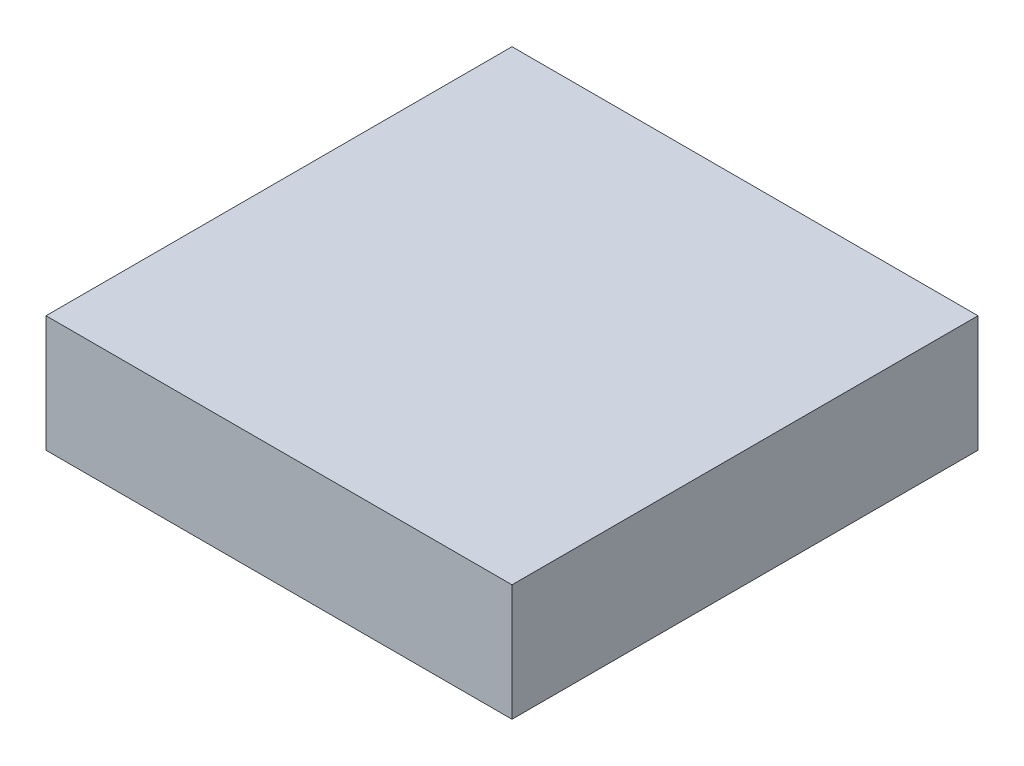
ISO-10303-21;
HEADER;
FILE_DESCRIPTION(('STEP AP214'),'2;1');
FILE_NAME('part.step','',(''),(''),'','','');
FILE_SCHEMA(('AUTOMOTIVE_DESIGN { 1 0 10303 214 1 1 1 1 }'));
ENDSEC;
DATA;
#1=APPLICATION_CONTEXT('core data for automotive mechanical design processes');
#2=APPLICATION_PROTOCOL_DEFINITION('international standard','automotive_design',2000,#1);
#3=PRODUCT_CONTEXT('',#1,'mechanical');
#4=PRODUCT('Part','Part','',(#3));
#5=PRODUCT_RELATED_PRODUCT_CATEGORY('part','',(#4));
#6=PRODUCT_DEFINITION_FORMATION('','',#4);
#7=PRODUCT_DEFINITION_CONTEXT('part definition',#1,'design');
#8=PRODUCT_DEFINITION('design','',#6,#7);
#9=PRODUCT_DEFINITION_SHAPE('','',#8);
#10=(LENGTH_UNIT() NAMED_UNIT(*) SI_UNIT(.MILLI.,.METRE.));
#11=(NAMED_UNIT(*) PLANE_ANGLE_UNIT() SI_UNIT($,.RADIAN.));
#12=(NAMED_UNIT(*) SI_UNIT($,.STERADIAN.) SOLID_ANGLE_UNIT());
#13=UNCERTAINTY_MEASURE_WITH_UNIT(LENGTH_MEASURE(1.E-05),#10,'distance_accuracy_value','');
#14=(GEOMETRIC_REPRESENTATION_CONTEXT(3) GLOBAL_UNCERTAINTY_ASSIGNED_CONTEXT((#13)) GLOBAL_UNIT_ASSIGNED_CONTEXT((#10,
#11,#12)) REPRESENTATION_CONTEXT('',''));
#15=CARTESIAN_POINT('',(0.,0.,0.));
#16=DIRECTION('',(0.,0.,1.));
#17=DIRECTION('',(1.,0.,0.));
#18=AXIS2_PLACEMENT_3D('',#15,#16,#17);
#19=CARTESIAN_POINT('',(-100.,50.,100.));
#20=DIRECTION('',(1.,0.,0.));
#21=DIRECTION('',(0.,0.,-1.));
#22=AXIS2_PLACEMENT_3D('',#19,#20,#21);
#23=PLANE('',#22);
#24=DIRECTION('',(0.,0.,1.));
#25=VECTOR('',#24,1.);
#26=CARTESIAN_POINT('',(-100.,0.,100.));
#27=LINE('',#26,#25);
#28=CARTESIAN_POINT('',(-100.,0.,-100.));
#29=VERTEX_POINT('',#28);
#30=CARTESIAN_POINT('',(-100.,0.,100.));
#31=VERTEX_POINT('',#30);
#32=EDGE_CURVE('E96',#29,#31,#27,.T.);
#33=ORIENTED_EDGE('',*,*,#32,.T.);
#34=DIRECTION('',(0.,-1.,0.));
#35=VECTOR('',#34,1.);
#36=CARTESIAN_POINT('',(-100.,50.,100.));
#37=LINE('',#36,#35);
#38=CARTESIAN_POINT('',(-100.,50.,100.));
#39=VERTEX_POINT('',#38);
#40=EDGE_CURVE('E11',#39,#31,#37,.T.);
#41=ORIENTED_EDGE('',*,*,#40,.F.);
#42=DIRECTION('',(0.,0.,1.));
#43=VECTOR('',#42,1.);
#44=CARTESIAN_POINT('',(-100.,50.,100.));
#45=LINE('',#44,#43);
#46=CARTESIAN_POINT('',(-100.,50.,-100.));
#47=VERTEX_POINT('',#46);
#48=EDGE_CURVE('E84',#47,#39,#45,.T.);
#49=ORIENTED_EDGE('',*,*,#48,.F.);
#50=DIRECTION('',(0.,-1.,0.));
#51=VECTOR('',#50,1.);
#52=CARTESIAN_POINT('',(-100.,50.,-100.));
#53=LINE('',#52,#51);
#54=EDGE_CURVE('E92',#47,#29,#53,.T.);
#55=ORIENTED_EDGE('',*,*,#54,.T.);
#56=EDGE_LOOP('',(#33,#41,#49,#55));
#57=FACE_BOUND('',#56,.T.);
#58=ADVANCED_FACE('F33',(#57),#23,.F.);
#59=CARTESIAN_POINT('',(100.,50.,100.));
#60=DIRECTION('',(0.,0.,-1.));
#61=DIRECTION('',(-1.,0.,0.));
#62=AXIS2_PLACEMENT_3D('',#59,#60,#61);
#63=PLANE('',#62);
#64=DIRECTION('',(1.,0.,0.));
#65=VECTOR('',#64,1.);
#66=CARTESIAN_POINT('',(100.,0.,100.));
#67=LINE('',#66,#65);
#68=CARTESIAN_POINT('',(100.,0.,100.));
#69=VERTEX_POINT('',#68);
#70=EDGE_CURVE('E88',#31,#69,#67,.T.);
#71=ORIENTED_EDGE('',*,*,#70,.T.);
#72=DIRECTION('',(0.,-1.,0.));
#73=VECTOR('',#72,1.);
#74=CARTESIAN_POINT('',(100.,50.,100.));
#75=LINE('',#74,#73);
#76=CARTESIAN_POINT('',(100.,50.,100.));
#77=VERTEX_POINT('',#76);
#78=EDGE_CURVE('E41',#77,#69,#75,.T.);
#79=ORIENTED_EDGE('',*,*,#78,.F.);
#80=DIRECTION('',(1.,0.,0.));
#81=VECTOR('',#80,1.);
#82=CARTESIAN_POINT('',(100.,50.,100.));
#83=LINE('',#82,#81);
#84=EDGE_CURVE('E79',#39,#77,#83,.T.);
#85=ORIENTED_EDGE('',*,*,#84,.F.);
#86=ORIENTED_EDGE('',*,*,#40,.T.);
#87=EDGE_LOOP('',(#71,#79,#85,#86));
#88=FACE_BOUND('',#87,.T.);
#89=ADVANCED_FACE('F87',(#88),#63,.F.);
#90=CARTESIAN_POINT('',(100.,50.,100.));
#91=DIRECTION('',(-1.,0.,0.));
#92=DIRECTION('',(0.,0.,1.));
#93=AXIS2_PLACEMENT_3D('',#90,#91,#92);
#94=PLANE('',#93);
#95=DIRECTION('',(0.,0.,-1.));
#96=VECTOR('',#95,1.);
#97=CARTESIAN_POINT('',(100.,0.,100.));
#98=LINE('',#97,#96);
#99=CARTESIAN_POINT('',(100.,0.,-100.));
#100=VERTEX_POINT('',#99);
#101=EDGE_CURVE('E66',#69,#100,#98,.T.);
#102=ORIENTED_EDGE('',*,*,#101,.T.);
#103=DIRECTION('',(0.,-1.,0.));
#104=VECTOR('',#103,1.);
#105=CARTESIAN_POINT('',(100.,50.,-100.));
#106=LINE('',#105,#104);
#107=CARTESIAN_POINT('',(100.,50.,-100.));
#108=VERTEX_POINT('',#107);
#109=EDGE_CURVE('E89',#108,#100,#106,.T.);
#110=ORIENTED_EDGE('',*,*,#109,.F.);
#111=DIRECTION('',(0.,0.,-1.));
#112=VECTOR('',#111,1.);
#113=CARTESIAN_POINT('',(100.,50.,100.));
#114=LINE('',#113,#112);
#115=EDGE_CURVE('E82',#77,#108,#114,.T.);
#116=ORIENTED_EDGE('',*,*,#115,.F.);
#117=ORIENTED_EDGE('',*,*,#78,.T.);
#118=EDGE_LOOP('',(#102,#110,#116,#117));
#119=FACE_BOUND('',#118,.T.);
#120=ADVANCED_FACE('F90',(#119),#94,.F.);
#121=CARTESIAN_POINT('',(100.,50.,-100.));
#122=DIRECTION('',(0.,0.,1.));
#123=DIRECTION('',(1.,0.,0.));
#124=AXIS2_PLACEMENT_3D('',#121,#122,#123);
#125=PLANE('',#124);
#126=DIRECTION('',(-1.,0.,0.));
#127=VECTOR('',#126,1.);
#128=CARTESIAN_POINT('',(100.,0.,-100.));
#129=LINE('',#128,#127);
#130=EDGE_CURVE('E72',#100,#29,#129,.T.);
#131=ORIENTED_EDGE('',*,*,#130,.T.);
#132=ORIENTED_EDGE('',*,*,#54,.F.);
#133=DIRECTION('',(-1.,0.,0.));
#134=VECTOR('',#133,1.);
#135=CARTESIAN_POINT('',(100.,50.,-100.));
#136=LINE('',#135,#134);
#137=EDGE_CURVE('E49',#108,#47,#136,.T.);
#138=ORIENTED_EDGE('',*,*,#137,.F.);
#139=ORIENTED_EDGE('',*,*,#109,.T.);
#140=EDGE_LOOP('',(#131,#132,#138,#139));
#141=FACE_BOUND('',#140,.T.);
#142=ADVANCED_FACE('F103',(#141),#125,.F.);
#143=CARTESIAN_POINT('',(0.,50.,0.));
#144=DIRECTION('',(0.,1.,0.));
#145=DIRECTION('',(0.,0.,1.));
#146=AXIS2_PLACEMENT_3D('',#143,#144,#145);
#147=PLANE('',#146);
#148=ORIENTED_EDGE('',*,*,#48,.T.);
#149=ORIENTED_EDGE('',*,*,#84,.T.);
#150=ORIENTED_EDGE('',*,*,#115,.T.);
#151=ORIENTED_EDGE('',*,*,#137,.T.);
#152=EDGE_LOOP('',(#148,#149,#150,#151));
#153=FACE_BOUND('',#152,.T.);
#154=ADVANCED_FACE('F80',(#153),#147,.T.);
#155=CARTESIAN_POINT('',(0.,0.,0.));
#156=DIRECTION('',(0.,1.,0.));
#157=DIRECTION('',(0.,0.,1.));
#158=AXIS2_PLACEMENT_3D('',#155,#156,#157);
#159=PLANE('',#158);
#160=ORIENTED_EDGE('',*,*,#32,.F.);
#161=ORIENTED_EDGE('',*,*,#130,.F.);
#162=ORIENTED_EDGE('',*,*,#101,.F.);
#163=ORIENTED_EDGE('',*,*,#70,.F.);
#164=EDGE_LOOP('',(#160,#161,#162,#163));
#165=FACE_BOUND('',#164,.T.);
#166=ADVANCED_FACE('F106',(#165),#159,.F.);
#167=CLOSED_SHELL('',(#58,#89,#120,#142,#154,#166));
#168=MANIFOLD_SOLID_BREP('B2',#167);
#169=ADVANCED_BREP_SHAPE_REPRESENTATION('',(#18,#168),#14);
#170=SHAPE_DEFINITION_REPRESENTATION(#9,#169);
ENDSEC;
END-ISO-10303-21;
